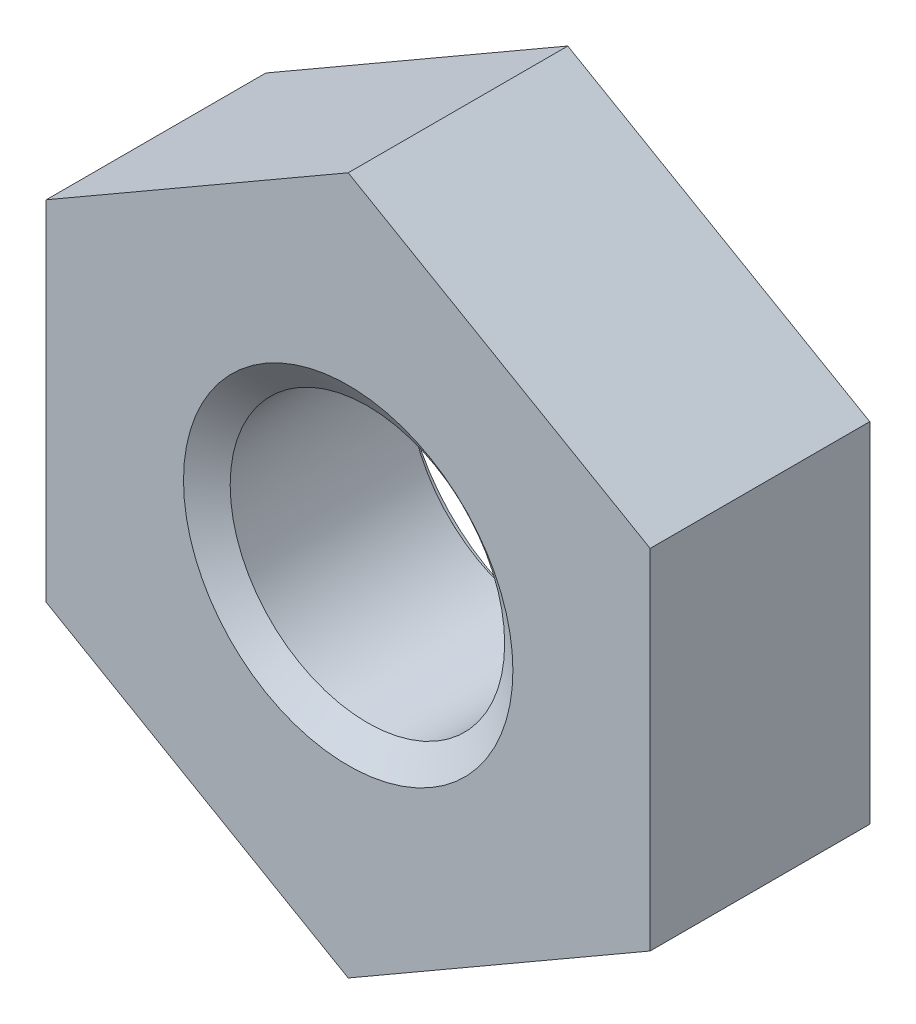
ISO-10303-21;
HEADER;
FILE_DESCRIPTION(('STEP AP214'),'2;1');
FILE_NAME('part.step','',(''),(''),'','','');
FILE_SCHEMA(('AUTOMOTIVE_DESIGN { 1 0 10303 214 1 1 1 1 }'));
ENDSEC;
DATA;
#1=APPLICATION_CONTEXT('core data for automotive mechanical design processes');
#2=APPLICATION_PROTOCOL_DEFINITION('international standard','automotive_design',2000,#1);
#3=PRODUCT_CONTEXT('',#1,'mechanical');
#4=PRODUCT('Part','Part','',(#3));
#5=PRODUCT_RELATED_PRODUCT_CATEGORY('part','',(#4));
#6=PRODUCT_DEFINITION_FORMATION('','',#4);
#7=PRODUCT_DEFINITION_CONTEXT('part definition',#1,'design');
#8=PRODUCT_DEFINITION('design','',#6,#7);
#9=PRODUCT_DEFINITION_SHAPE('','',#8);
#10=(LENGTH_UNIT() NAMED_UNIT(*) SI_UNIT(.MILLI.,.METRE.));
#11=(NAMED_UNIT(*) PLANE_ANGLE_UNIT() SI_UNIT($,.RADIAN.));
#12=(NAMED_UNIT(*) SI_UNIT($,.STERADIAN.) SOLID_ANGLE_UNIT());
#13=UNCERTAINTY_MEASURE_WITH_UNIT(LENGTH_MEASURE(1.E-05),#10,'distance_accuracy_value','');
#14=(GEOMETRIC_REPRESENTATION_CONTEXT(3) GLOBAL_UNCERTAINTY_ASSIGNED_CONTEXT((#13)) GLOBAL_UNIT_ASSIGNED_CONTEXT((#10,
#11,#12)) REPRESENTATION_CONTEXT('',''));
#15=CARTESIAN_POINT('',(0.,0.,0.));
#16=DIRECTION('',(0.,0.,1.));
#17=DIRECTION('',(1.,0.,0.));
#18=AXIS2_PLACEMENT_3D('',#15,#16,#17);
#19=CARTESIAN_POINT('',(0.,0.,-2.));
#20=DIRECTION('',(0.,0.,1.));
#21=DIRECTION('',(1.,0.,0.));
#22=AXIS2_PLACEMENT_3D('',#19,#20,#21);
#23=CYLINDRICAL_SURFACE('',#22,1.25);
#24=CARTESIAN_POINT('',(0.,0.,-0.175051884552429));
#25=DIRECTION('',(0.,0.,1.));
#26=DIRECTION('',(1.,0.,0.));
#27=AXIS2_PLACEMENT_3D('',#24,#25,#26);
#28=CIRCLE('',#27,1.25);
#29=CARTESIAN_POINT('',(1.25,0.,-0.175051884552429));
#30=VERTEX_POINT('',#29);
#31=EDGE_CURVE('E128',#30,#30,#28,.F.);
#32=ORIENTED_EDGE('',*,*,#31,.F.);
#33=EDGE_LOOP('',(#32));
#34=FACE_BOUND('',#33,.T.);
#35=CARTESIAN_POINT('',(0.,0.,-1.79954811544757));
#36=DIRECTION('',(0.,0.,-1.));
#37=DIRECTION('',(-1.,0.,0.));
#38=AXIS2_PLACEMENT_3D('',#35,#36,#37);
#39=CIRCLE('',#38,1.25);
#40=CARTESIAN_POINT('',(-1.25,0.,-1.79954811544757));
#41=VERTEX_POINT('',#40);
#42=EDGE_CURVE('E41',#41,#41,#39,.F.);
#43=ORIENTED_EDGE('',*,*,#42,.F.);
#44=EDGE_LOOP('',(#43));
#45=FACE_BOUND('',#44,.T.);
#46=ADVANCED_FACE('F37',(#34,#45),#23,.F.);
#47=CARTESIAN_POINT('',(0.,3.17542648054294,-2.));
#48=DIRECTION('',(-0.500000000000001,0.866025403784438,0.));
#49=DIRECTION('',(-0.866025403784438,-0.500000000000001,0.));
#50=AXIS2_PLACEMENT_3D('',#47,#48,#49);
#51=PLANE('',#50);
#52=DIRECTION('',(-0.866025403784438,-0.500000000000001,0.));
#53=VECTOR('',#52,1.);
#54=CARTESIAN_POINT('',(0.,3.17542648054294,0.));
#55=LINE('',#54,#53);
#56=CARTESIAN_POINT('',(0.,3.17542648054294,0.));
#57=VERTEX_POINT('',#56);
#58=CARTESIAN_POINT('',(-2.75,1.58771324027147,0.));
#59=VERTEX_POINT('',#58);
#60=EDGE_CURVE('E124',#57,#59,#55,.T.);
#61=ORIENTED_EDGE('',*,*,#60,.F.);
#62=DIRECTION('',(0.,0.,1.));
#63=VECTOR('',#62,1.);
#64=CARTESIAN_POINT('',(0.,3.17542648054294,-2.));
#65=LINE('',#64,#63);
#66=CARTESIAN_POINT('',(0.,3.17542648054294,-2.));
#67=VERTEX_POINT('',#66);
#68=EDGE_CURVE('E11',#67,#57,#65,.T.);
#69=ORIENTED_EDGE('',*,*,#68,.F.);
#70=DIRECTION('',(-0.866025403784438,-0.500000000000001,0.));
#71=VECTOR('',#70,1.);
#72=CARTESIAN_POINT('',(0.,3.17542648054294,-2.));
#73=LINE('',#72,#71);
#74=CARTESIAN_POINT('',(-2.75,1.58771324027147,-2.));
#75=VERTEX_POINT('',#74);
#76=EDGE_CURVE('E139',#67,#75,#73,.T.);
#77=ORIENTED_EDGE('',*,*,#76,.T.);
#78=DIRECTION('',(0.,0.,1.));
#79=VECTOR('',#78,1.);
#80=CARTESIAN_POINT('',(-2.75,1.58771324027147,-2.));
#81=LINE('',#80,#79);
#82=EDGE_CURVE('E88',#75,#59,#81,.T.);
#83=ORIENTED_EDGE('',*,*,#82,.T.);
#84=EDGE_LOOP('',(#61,#69,#77,#83));
#85=FACE_BOUND('',#84,.T.);
#86=ADVANCED_FACE('F39',(#85),#51,.T.);
#87=CARTESIAN_POINT('',(2.75,1.58771324027147,-2.));
#88=DIRECTION('',(0.5,0.866025403784438,0.));
#89=DIRECTION('',(-0.866025403784438,0.5,0.));
#90=AXIS2_PLACEMENT_3D('',#87,#88,#89);
#91=PLANE('',#90);
#92=DIRECTION('',(-0.866025403784438,0.5,0.));
#93=VECTOR('',#92,1.);
#94=CARTESIAN_POINT('',(2.75,1.58771324027147,0.));
#95=LINE('',#94,#93);
#96=CARTESIAN_POINT('',(2.75,1.58771324027147,0.));
#97=VERTEX_POINT('',#96);
#98=EDGE_CURVE('E137',#97,#57,#95,.T.);
#99=ORIENTED_EDGE('',*,*,#98,.F.);
#100=DIRECTION('',(0.,0.,1.));
#101=VECTOR('',#100,1.);
#102=CARTESIAN_POINT('',(2.75,1.58771324027147,-2.));
#103=LINE('',#102,#101);
#104=CARTESIAN_POINT('',(2.75,1.58771324027147,-2.));
#105=VERTEX_POINT('',#104);
#106=EDGE_CURVE('E47',#105,#97,#103,.T.);
#107=ORIENTED_EDGE('',*,*,#106,.F.);
#108=DIRECTION('',(-0.866025403784438,0.5,0.));
#109=VECTOR('',#108,1.);
#110=CARTESIAN_POINT('',(2.75,1.58771324027147,-2.));
#111=LINE('',#110,#109);
#112=EDGE_CURVE('E106',#105,#67,#111,.T.);
#113=ORIENTED_EDGE('',*,*,#112,.T.);
#114=ORIENTED_EDGE('',*,*,#68,.T.);
#115=EDGE_LOOP('',(#99,#107,#113,#114));
#116=FACE_BOUND('',#115,.T.);
#117=ADVANCED_FACE('F165',(#116),#91,.T.);
#118=CARTESIAN_POINT('',(2.75,1.58771324027147,-2.));
#119=DIRECTION('',(-1.,0.,0.));
#120=DIRECTION('',(0.,0.,1.));
#121=AXIS2_PLACEMENT_3D('',#118,#119,#120);
#122=PLANE('',#121);
#123=DIRECTION('',(0.,-1.,0.));
#124=VECTOR('',#123,1.);
#125=CARTESIAN_POINT('',(2.75,1.58771324027147,0.));
#126=LINE('',#125,#124);
#127=CARTESIAN_POINT('',(2.75,-1.58771324027147,0.));
#128=VERTEX_POINT('',#127);
#129=EDGE_CURVE('E110',#97,#128,#126,.T.);
#130=ORIENTED_EDGE('',*,*,#129,.T.);
#131=DIRECTION('',(0.,0.,1.));
#132=VECTOR('',#131,1.);
#133=CARTESIAN_POINT('',(2.75,-1.58771324027147,-2.));
#134=LINE('',#133,#132);
#135=CARTESIAN_POINT('',(2.75,-1.58771324027147,-2.));
#136=VERTEX_POINT('',#135);
#137=EDGE_CURVE('E108',#136,#128,#134,.T.);
#138=ORIENTED_EDGE('',*,*,#137,.F.);
#139=DIRECTION('',(0.,-1.,0.));
#140=VECTOR('',#139,1.);
#141=CARTESIAN_POINT('',(2.75,1.58771324027147,-2.));
#142=LINE('',#141,#140);
#143=EDGE_CURVE('E99',#105,#136,#142,.T.);
#144=ORIENTED_EDGE('',*,*,#143,.F.);
#145=ORIENTED_EDGE('',*,*,#106,.T.);
#146=EDGE_LOOP('',(#130,#138,#144,#145));
#147=FACE_BOUND('',#146,.T.);
#148=ADVANCED_FACE('F109',(#147),#122,.F.);
#149=CARTESIAN_POINT('',(0.,-3.17542648054295,-2.));
#150=DIRECTION('',(0.500000000000001,-0.866025403784438,0.));
#151=DIRECTION('',(0.866025403784438,0.500000000000001,0.));
#152=AXIS2_PLACEMENT_3D('',#149,#150,#151);
#153=PLANE('',#152);
#154=DIRECTION('',(0.866025403784438,0.500000000000001,0.));
#155=VECTOR('',#154,1.);
#156=CARTESIAN_POINT('',(0.,-3.17542648054295,0.));
#157=LINE('',#156,#155);
#158=CARTESIAN_POINT('',(0.,-3.17542648054295,0.));
#159=VERTEX_POINT('',#158);
#160=EDGE_CURVE('E134',#159,#128,#157,.T.);
#161=ORIENTED_EDGE('',*,*,#160,.F.);
#162=DIRECTION('',(0.,0.,1.));
#163=VECTOR('',#162,1.);
#164=CARTESIAN_POINT('',(0.,-3.17542648054295,-2.));
#165=LINE('',#164,#163);
#166=CARTESIAN_POINT('',(0.,-3.17542648054295,-2.));
#167=VERTEX_POINT('',#166);
#168=EDGE_CURVE('E114',#167,#159,#165,.T.);
#169=ORIENTED_EDGE('',*,*,#168,.F.);
#170=DIRECTION('',(0.866025403784438,0.500000000000001,0.));
#171=VECTOR('',#170,1.);
#172=CARTESIAN_POINT('',(0.,-3.17542648054295,-2.));
#173=LINE('',#172,#171);
#174=EDGE_CURVE('E104',#167,#136,#173,.T.);
#175=ORIENTED_EDGE('',*,*,#174,.T.);
#176=ORIENTED_EDGE('',*,*,#137,.T.);
#177=EDGE_LOOP('',(#161,#169,#175,#176));
#178=FACE_BOUND('',#177,.T.);
#179=ADVANCED_FACE('F116',(#178),#153,.T.);
#180=CARTESIAN_POINT('',(-2.75,-1.58771324027147,-2.));
#181=DIRECTION('',(-0.5,-0.866025403784439,0.));
#182=DIRECTION('',(0.866025403784438,-0.5,0.));
#183=AXIS2_PLACEMENT_3D('',#180,#181,#182);
#184=PLANE('',#183);
#185=DIRECTION('',(0.866025403784438,-0.5,0.));
#186=VECTOR('',#185,1.);
#187=CARTESIAN_POINT('',(-2.75,-1.58771324027147,0.));
#188=LINE('',#187,#186);
#189=CARTESIAN_POINT('',(-2.75,-1.58771324027147,0.));
#190=VERTEX_POINT('',#189);
#191=EDGE_CURVE('E131',#190,#159,#188,.T.);
#192=ORIENTED_EDGE('',*,*,#191,.F.);
#193=DIRECTION('',(0.,0.,1.));
#194=VECTOR('',#193,1.);
#195=CARTESIAN_POINT('',(-2.75,-1.58771324027147,-2.));
#196=LINE('',#195,#194);
#197=CARTESIAN_POINT('',(-2.75,-1.58771324027147,-2.));
#198=VERTEX_POINT('',#197);
#199=EDGE_CURVE('E143',#198,#190,#196,.T.);
#200=ORIENTED_EDGE('',*,*,#199,.F.);
#201=DIRECTION('',(0.866025403784438,-0.5,0.));
#202=VECTOR('',#201,1.);
#203=CARTESIAN_POINT('',(-2.75,-1.58771324027147,-2.));
#204=LINE('',#203,#202);
#205=EDGE_CURVE('E117',#198,#167,#204,.T.);
#206=ORIENTED_EDGE('',*,*,#205,.T.);
#207=ORIENTED_EDGE('',*,*,#168,.T.);
#208=EDGE_LOOP('',(#192,#200,#206,#207));
#209=FACE_BOUND('',#208,.T.);
#210=ADVANCED_FACE('F242',(#209),#184,.T.);
#211=CARTESIAN_POINT('',(-2.75,1.58771324027147,-2.));
#212=DIRECTION('',(-1.,0.,0.));
#213=DIRECTION('',(0.,0.,1.));
#214=AXIS2_PLACEMENT_3D('',#211,#212,#213);
#215=PLANE('',#214);
#216=DIRECTION('',(0.,-1.,0.));
#217=VECTOR('',#216,1.);
#218=CARTESIAN_POINT('',(-2.75,1.58771324027147,0.));
#219=LINE('',#218,#217);
#220=EDGE_CURVE('E127',#59,#190,#219,.T.);
#221=ORIENTED_EDGE('',*,*,#220,.F.);
#222=ORIENTED_EDGE('',*,*,#82,.F.);
#223=DIRECTION('',(0.,-1.,0.));
#224=VECTOR('',#223,1.);
#225=CARTESIAN_POINT('',(-2.75,1.58771324027147,-2.));
#226=LINE('',#225,#224);
#227=EDGE_CURVE('E119',#75,#198,#226,.T.);
#228=ORIENTED_EDGE('',*,*,#227,.T.);
#229=ORIENTED_EDGE('',*,*,#199,.T.);
#230=EDGE_LOOP('',(#221,#222,#228,#229));
#231=FACE_BOUND('',#230,.T.);
#232=ADVANCED_FACE('F161',(#231),#215,.T.);
#233=CARTESIAN_POINT('',(0.,3.17542648054294,-2.));
#234=DIRECTION('',(0.,0.,-1.));
#235=DIRECTION('',(-1.,0.,0.));
#236=AXIS2_PLACEMENT_3D('',#233,#234,#235);
#237=PLANE('',#236);
#238=CARTESIAN_POINT('',(0.,0.,-2.));
#239=DIRECTION('',(0.,0.,-1.));
#240=DIRECTION('',(-1.,0.,0.));
#241=AXIS2_PLACEMENT_3D('',#238,#239,#240);
#242=CIRCLE('',#241,1.5);
#243=CARTESIAN_POINT('',(-1.5,0.,-2.));
#244=VERTEX_POINT('',#243);
#245=EDGE_CURVE('E148',#244,#244,#242,.F.);
#246=ORIENTED_EDGE('',*,*,#245,.T.);
#247=EDGE_LOOP('',(#246));
#248=FACE_BOUND('',#247,.T.);
#249=ORIENTED_EDGE('',*,*,#76,.F.);
#250=ORIENTED_EDGE('',*,*,#112,.F.);
#251=ORIENTED_EDGE('',*,*,#143,.T.);
#252=ORIENTED_EDGE('',*,*,#174,.F.);
#253=ORIENTED_EDGE('',*,*,#205,.F.);
#254=ORIENTED_EDGE('',*,*,#227,.F.);
#255=EDGE_LOOP('',(#249,#250,#251,#252,#253,#254));
#256=FACE_BOUND('',#255,.T.);
#257=ADVANCED_FACE('F101',(#248,#256),#237,.T.);
#258=CARTESIAN_POINT('',(0.,3.17542648054294,0.));
#259=DIRECTION('',(0.,0.,-1.));
#260=DIRECTION('',(-1.,0.,0.));
#261=AXIS2_PLACEMENT_3D('',#258,#259,#260);
#262=PLANE('',#261);
#263=CARTESIAN_POINT('',(0.,0.,0.));
#264=DIRECTION('',(0.,0.,1.));
#265=DIRECTION('',(1.,0.,0.));
#266=AXIS2_PLACEMENT_3D('',#263,#264,#265);
#267=CIRCLE('',#266,1.5);
#268=CARTESIAN_POINT('',(1.5,0.,0.));
#269=VERTEX_POINT('',#268);
#270=EDGE_CURVE('E147',#269,#269,#267,.T.);
#271=ORIENTED_EDGE('',*,*,#270,.F.);
#272=EDGE_LOOP('',(#271));
#273=FACE_BOUND('',#272,.T.);
#274=ORIENTED_EDGE('',*,*,#60,.T.);
#275=ORIENTED_EDGE('',*,*,#220,.T.);
#276=ORIENTED_EDGE('',*,*,#191,.T.);
#277=ORIENTED_EDGE('',*,*,#160,.T.);
#278=ORIENTED_EDGE('',*,*,#129,.F.);
#279=ORIENTED_EDGE('',*,*,#98,.T.);
#280=EDGE_LOOP('',(#274,#275,#276,#277,#278,#279));
#281=FACE_BOUND('',#280,.T.);
#282=ADVANCED_FACE('F164',(#273,#281),#262,.F.);
#283=CARTESIAN_POINT('',(0.,0.,-0.192557073007672));
#284=DIRECTION('',(0.,0.,1.));
#285=DIRECTION('',(1.,0.,0.));
#286=AXIS2_PLACEMENT_3D('',#283,#284,#285);
#287=CONICAL_SURFACE('',#286,1.225,0.959931088596877);
#288=ORIENTED_EDGE('',*,*,#270,.T.);
#289=EDGE_LOOP('',(#288));
#290=FACE_BOUND('',#289,.T.);
#291=ORIENTED_EDGE('',*,*,#31,.T.);
#292=EDGE_LOOP('',(#291));
#293=FACE_BOUND('',#292,.T.);
#294=ADVANCED_FACE('F183',(#290,#293),#287,.F.);
#295=CARTESIAN_POINT('',(0.,0.,-1.9746));
#296=DIRECTION('',(0.,0.,-1.));
#297=DIRECTION('',(-1.,0.,0.));
#298=AXIS2_PLACEMENT_3D('',#295,#296,#297);
#299=CONICAL_SURFACE('',#298,1.5,0.959931088596876);
#300=CARTESIAN_POINT('',(0.,0.,-1.9746));
#301=DIRECTION('',(0.,0.,1.));
#302=DIRECTION('',(1.,0.,0.));
#303=AXIS2_PLACEMENT_3D('',#300,#301,#302);
#304=CIRCLE('',#303,1.5);
#305=CARTESIAN_POINT('',(1.5,0.,-1.9746));
#306=VERTEX_POINT('',#305);
#307=EDGE_CURVE('E150',#306,#306,#304,.T.);
#308=ORIENTED_EDGE('',*,*,#307,.F.);
#309=EDGE_LOOP('',(#308));
#310=FACE_BOUND('',#309,.T.);
#311=ORIENTED_EDGE('',*,*,#42,.T.);
#312=EDGE_LOOP('',(#311));
#313=FACE_BOUND('',#312,.T.);
#314=ADVANCED_FACE('F191',(#310,#313),#299,.F.);
#315=CARTESIAN_POINT('',(0.,0.,-25.0375057290932));
#316=DIRECTION('',(0.,0.,1.));
#317=DIRECTION('',(1.,0.,0.));
#318=AXIS2_PLACEMENT_3D('',#315,#316,#317);
#319=CYLINDRICAL_SURFACE('',#318,1.5);
#320=ORIENTED_EDGE('',*,*,#245,.F.);
#321=EDGE_LOOP('',(#320));
#322=FACE_BOUND('',#321,.T.);
#323=ORIENTED_EDGE('',*,*,#307,.T.);
#324=EDGE_LOOP('',(#323));
#325=FACE_BOUND('',#324,.T.);
#326=ADVANCED_FACE('F198',(#322,#325),#319,.F.);
#327=CLOSED_SHELL('',(#46,#86,#117,#148,#179,#210,#232,#257,#282,#294,#314,#326));
#328=MANIFOLD_SOLID_BREP('B2',#327);
#329=ADVANCED_BREP_SHAPE_REPRESENTATION('',(#18,#328),#14);
#330=SHAPE_DEFINITION_REPRESENTATION(#9,#329);
ENDSEC;
END-ISO-10303-21;
